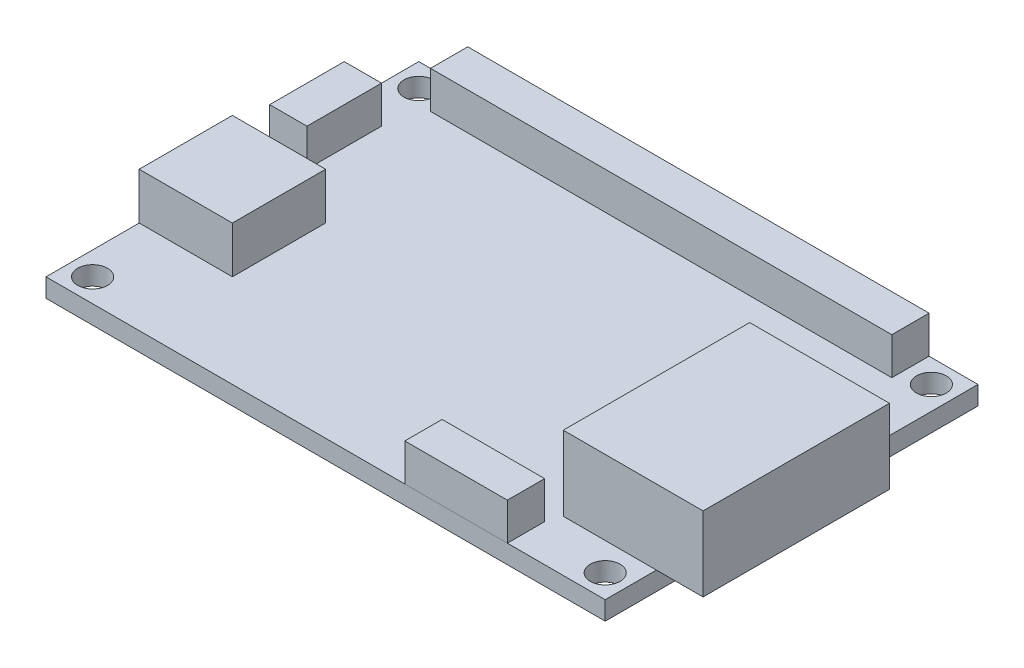
ISO-10303-21;
HEADER;
FILE_DESCRIPTION(('STEP AP214'),'2;1');
FILE_NAME('part.step','',(''),(''),'','','');
FILE_SCHEMA(('AUTOMOTIVE_DESIGN { 1 0 10303 214 1 1 1 1 }'));
ENDSEC;
DATA;
#1=APPLICATION_CONTEXT('core data for automotive mechanical design processes');
#2=APPLICATION_PROTOCOL_DEFINITION('international standard','automotive_design',2000,#1);
#3=PRODUCT_CONTEXT('',#1,'mechanical');
#4=PRODUCT('Part','Part','',(#3));
#5=PRODUCT_RELATED_PRODUCT_CATEGORY('part','',(#4));
#6=PRODUCT_DEFINITION_FORMATION('','',#4);
#7=PRODUCT_DEFINITION_CONTEXT('part definition',#1,'design');
#8=PRODUCT_DEFINITION('design','',#6,#7);
#9=PRODUCT_DEFINITION_SHAPE('','',#8);
#10=(LENGTH_UNIT() NAMED_UNIT(*) SI_UNIT(.MILLI.,.METRE.));
#11=(NAMED_UNIT(*) PLANE_ANGLE_UNIT() SI_UNIT($,.RADIAN.));
#12=(NAMED_UNIT(*) SI_UNIT($,.STERADIAN.) SOLID_ANGLE_UNIT());
#13=UNCERTAINTY_MEASURE_WITH_UNIT(LENGTH_MEASURE(1.E-05),#10,'distance_accuracy_value','');
#14=(GEOMETRIC_REPRESENTATION_CONTEXT(3) GLOBAL_UNCERTAINTY_ASSIGNED_CONTEXT((#13)) GLOBAL_UNIT_ASSIGNED_CONTEXT((#10,
#11,#12)) REPRESENTATION_CONTEXT('',''));
#15=CARTESIAN_POINT('',(0.,0.,0.));
#16=DIRECTION('',(0.,0.,1.));
#17=DIRECTION('',(1.,0.,0.));
#18=AXIS2_PLACEMENT_3D('',#15,#16,#17);
#19=CARTESIAN_POINT('',(0.,10.,14.5));
#20=DIRECTION('',(0.,0.,1.));
#21=DIRECTION('',(1.,0.,0.));
#22=AXIS2_PLACEMENT_3D('',#19,#20,#21);
#23=PLANE('',#22);
#24=DIRECTION('',(-1.,0.,0.));
#25=VECTOR('',#24,1.);
#26=CARTESIAN_POINT('',(0.,2.,14.5));
#27=LINE('',#26,#25);
#28=CARTESIAN_POINT('',(35.,2.,14.5));
#29=VERTEX_POINT('',#28);
#30=CARTESIAN_POINT('',(20.,2.,14.5));
#31=VERTEX_POINT('',#30);
#32=EDGE_CURVE('E176',#29,#31,#27,.T.);
#33=ORIENTED_EDGE('',*,*,#32,.F.);
#34=DIRECTION('',(0.,-1.,0.));
#35=VECTOR('',#34,1.);
#36=CARTESIAN_POINT('',(35.,10.,14.5));
#37=LINE('',#36,#35);
#38=CARTESIAN_POINT('',(35.,10.,14.5));
#39=VERTEX_POINT('',#38);
#40=EDGE_CURVE('E13',#39,#29,#37,.T.);
#41=ORIENTED_EDGE('',*,*,#40,.F.);
#42=DIRECTION('',(-1.,0.,0.));
#43=VECTOR('',#42,1.);
#44=CARTESIAN_POINT('',(0.,10.,14.5));
#45=LINE('',#44,#43);
#46=CARTESIAN_POINT('',(20.,10.,14.5));
#47=VERTEX_POINT('',#46);
#48=EDGE_CURVE('E170',#39,#47,#45,.T.);
#49=ORIENTED_EDGE('',*,*,#48,.T.);
#50=DIRECTION('',(0.,-1.,0.));
#51=VECTOR('',#50,1.);
#52=CARTESIAN_POINT('',(20.,10.,14.5));
#53=LINE('',#52,#51);
#54=EDGE_CURVE('E151',#47,#31,#53,.T.);
#55=ORIENTED_EDGE('',*,*,#54,.T.);
#56=EDGE_LOOP('',(#33,#41,#49,#55));
#57=FACE_BOUND('',#56,.T.);
#58=ADVANCED_FACE('F113',(#57),#23,.T.);
#59=CARTESIAN_POINT('',(35.,10.,0.));
#60=DIRECTION('',(1.,0.,0.));
#61=DIRECTION('',(0.,0.,-1.));
#62=AXIS2_PLACEMENT_3D('',#59,#60,#61);
#63=PLANE('',#62);
#64=DIRECTION('',(0.,0.,1.));
#65=VECTOR('',#64,1.);
#66=CARTESIAN_POINT('',(35.,2.,0.));
#67=LINE('',#66,#65);
#68=CARTESIAN_POINT('',(35.,2.,-5.49999999999999));
#69=VERTEX_POINT('',#68);
#70=EDGE_CURVE('E164',#69,#29,#67,.T.);
#71=ORIENTED_EDGE('',*,*,#70,.F.);
#72=DIRECTION('',(0.,-1.,0.));
#73=VECTOR('',#72,1.);
#74=CARTESIAN_POINT('',(35.,10.,-5.49999999999999));
#75=LINE('',#74,#73);
#76=CARTESIAN_POINT('',(35.,10.,-5.49999999999999));
#77=VERTEX_POINT('',#76);
#78=EDGE_CURVE('E121',#77,#69,#75,.T.);
#79=ORIENTED_EDGE('',*,*,#78,.F.);
#80=DIRECTION('',(0.,0.,1.));
#81=VECTOR('',#80,1.);
#82=CARTESIAN_POINT('',(35.,10.,0.));
#83=LINE('',#82,#81);
#84=EDGE_CURVE('E162',#77,#39,#83,.T.);
#85=ORIENTED_EDGE('',*,*,#84,.T.);
#86=ORIENTED_EDGE('',*,*,#40,.T.);
#87=EDGE_LOOP('',(#71,#79,#85,#86));
#88=FACE_BOUND('',#87,.T.);
#89=ADVANCED_FACE('F160',(#88),#63,.T.);
#90=CARTESIAN_POINT('',(0.,10.,-5.49999999999998));
#91=DIRECTION('',(0.,0.,1.));
#92=DIRECTION('',(1.,0.,0.));
#93=AXIS2_PLACEMENT_3D('',#90,#91,#92);
#94=PLANE('',#93);
#95=DIRECTION('',(-1.,0.,0.));
#96=VECTOR('',#95,1.);
#97=CARTESIAN_POINT('',(0.,2.,-5.49999999999998));
#98=LINE('',#97,#96);
#99=CARTESIAN_POINT('',(20.,2.,-5.49999999999999));
#100=VERTEX_POINT('',#99);
#101=EDGE_CURVE('E144',#69,#100,#98,.T.);
#102=ORIENTED_EDGE('',*,*,#101,.T.);
#103=DIRECTION('',(0.,-1.,0.));
#104=VECTOR('',#103,1.);
#105=CARTESIAN_POINT('',(20.,10.,-5.49999999999999));
#106=LINE('',#105,#104);
#107=CARTESIAN_POINT('',(20.,10.,-5.49999999999999));
#108=VERTEX_POINT('',#107);
#109=EDGE_CURVE('E165',#108,#100,#106,.T.);
#110=ORIENTED_EDGE('',*,*,#109,.F.);
#111=DIRECTION('',(-1.,0.,0.));
#112=VECTOR('',#111,1.);
#113=CARTESIAN_POINT('',(0.,10.,-5.49999999999998));
#114=LINE('',#113,#112);
#115=EDGE_CURVE('E166',#77,#108,#114,.T.);
#116=ORIENTED_EDGE('',*,*,#115,.F.);
#117=ORIENTED_EDGE('',*,*,#78,.T.);
#118=EDGE_LOOP('',(#102,#110,#116,#117));
#119=FACE_BOUND('',#118,.T.);
#120=ADVANCED_FACE('F167',(#119),#94,.F.);
#121=CARTESIAN_POINT('',(20.,10.,0.));
#122=DIRECTION('',(1.,0.,0.));
#123=DIRECTION('',(0.,0.,-1.));
#124=AXIS2_PLACEMENT_3D('',#121,#122,#123);
#125=PLANE('',#124);
#126=DIRECTION('',(0.,0.,1.));
#127=VECTOR('',#126,1.);
#128=CARTESIAN_POINT('',(20.,2.,0.));
#129=LINE('',#128,#127);
#130=EDGE_CURVE('E172',#100,#31,#129,.T.);
#131=ORIENTED_EDGE('',*,*,#130,.T.);
#132=ORIENTED_EDGE('',*,*,#54,.F.);
#133=DIRECTION('',(0.,0.,1.));
#134=VECTOR('',#133,1.);
#135=CARTESIAN_POINT('',(20.,10.,0.));
#136=LINE('',#135,#134);
#137=EDGE_CURVE('E129',#108,#47,#136,.T.);
#138=ORIENTED_EDGE('',*,*,#137,.F.);
#139=ORIENTED_EDGE('',*,*,#109,.T.);
#140=EDGE_LOOP('',(#131,#132,#138,#139));
#141=FACE_BOUND('',#140,.T.);
#142=ADVANCED_FACE('F185',(#141),#125,.F.);
#143=CARTESIAN_POINT('',(0.,10.,0.));
#144=DIRECTION('',(0.,1.,0.));
#145=DIRECTION('',(0.,0.,1.));
#146=AXIS2_PLACEMENT_3D('',#143,#144,#145);
#147=PLANE('',#146);
#148=ORIENTED_EDGE('',*,*,#48,.F.);
#149=ORIENTED_EDGE('',*,*,#84,.F.);
#150=ORIENTED_EDGE('',*,*,#115,.T.);
#151=ORIENTED_EDGE('',*,*,#137,.T.);
#152=EDGE_LOOP('',(#148,#149,#150,#151));
#153=FACE_BOUND('',#152,.T.);
#154=ADVANCED_FACE('F169',(#153),#147,.T.);
#155=CARTESIAN_POINT('',(0.,2.,0.));
#156=DIRECTION('',(0.,1.,0.));
#157=DIRECTION('',(0.,0.,1.));
#158=AXIS2_PLACEMENT_3D('',#155,#156,#157);
#159=PLANE('',#158);
#160=ORIENTED_EDGE('',*,*,#32,.T.);
#161=ORIENTED_EDGE('',*,*,#130,.F.);
#162=ORIENTED_EDGE('',*,*,#101,.F.);
#163=ORIENTED_EDGE('',*,*,#70,.T.);
#164=EDGE_LOOP('',(#160,#161,#162,#163));
#165=FACE_BOUND('',#164,.T.);
#166=ADVANCED_FACE('F187',(#165),#159,.F.);
#167=CLOSED_SHELL('',(#58,#89,#120,#142,#154,#166));
#168=MANIFOLD_SOLID_BREP('B2',#167);
#169=CARTESIAN_POINT('',(-20.,7.,0.));
#170=DIRECTION('',(1.,0.,0.));
#171=DIRECTION('',(0.,0.,-1.));
#172=AXIS2_PLACEMENT_3D('',#169,#170,#171);
#173=PLANE('',#172);
#174=DIRECTION('',(0.,0.,1.));
#175=VECTOR('',#174,1.);
#176=CARTESIAN_POINT('',(-20.,2.,0.));
#177=LINE('',#176,#175);
#178=CARTESIAN_POINT('',(-20.,2.,0.));
#179=VERTEX_POINT('',#178);
#180=CARTESIAN_POINT('',(-20.,2.,10.));
#181=VERTEX_POINT('',#180);
#182=EDGE_CURVE('E327',#179,#181,#177,.T.);
#183=ORIENTED_EDGE('',*,*,#182,.F.);
#184=DIRECTION('',(0.,-1.,0.));
#185=VECTOR('',#184,1.);
#186=CARTESIAN_POINT('',(-20.,7.,0.));
#187=LINE('',#186,#185);
#188=CARTESIAN_POINT('',(-20.,7.,0.));
#189=VERTEX_POINT('',#188);
#190=EDGE_CURVE('E111',#189,#179,#187,.T.);
#191=ORIENTED_EDGE('',*,*,#190,.F.);
#192=DIRECTION('',(0.,0.,1.));
#193=VECTOR('',#192,1.);
#194=CARTESIAN_POINT('',(-20.,7.,0.));
#195=LINE('',#194,#193);
#196=CARTESIAN_POINT('',(-20.,7.,10.));
#197=VERTEX_POINT('',#196);
#198=EDGE_CURVE('E321',#189,#197,#195,.T.);
#199=ORIENTED_EDGE('',*,*,#198,.T.);
#200=DIRECTION('',(0.,-1.,0.));
#201=VECTOR('',#200,1.);
#202=CARTESIAN_POINT('',(-20.,7.,10.));
#203=LINE('',#202,#201);
#204=EDGE_CURVE('E302',#197,#181,#203,.T.);
#205=ORIENTED_EDGE('',*,*,#204,.T.);
#206=EDGE_LOOP('',(#183,#191,#199,#205));
#207=FACE_BOUND('',#206,.T.);
#208=ADVANCED_FACE('F264',(#207),#173,.T.);
#209=CARTESIAN_POINT('',(0.,7.,0.));
#210=DIRECTION('',(0.,0.,-1.));
#211=DIRECTION('',(-1.,0.,0.));
#212=AXIS2_PLACEMENT_3D('',#209,#210,#211);
#213=PLANE('',#212);
#214=DIRECTION('',(1.,0.,0.));
#215=VECTOR('',#214,1.);
#216=CARTESIAN_POINT('',(0.,2.,0.));
#217=LINE('',#216,#215);
#218=CARTESIAN_POINT('',(-30.,2.,0.));
#219=VERTEX_POINT('',#218);
#220=EDGE_CURVE('E315',#219,#179,#217,.T.);
#221=ORIENTED_EDGE('',*,*,#220,.F.);
#222=DIRECTION('',(0.,-1.,0.));
#223=VECTOR('',#222,1.);
#224=CARTESIAN_POINT('',(-30.,7.,0.));
#225=LINE('',#224,#223);
#226=CARTESIAN_POINT('',(-30.,7.,0.));
#227=VERTEX_POINT('',#226);
#228=EDGE_CURVE('E272',#227,#219,#225,.T.);
#229=ORIENTED_EDGE('',*,*,#228,.F.);
#230=DIRECTION('',(1.,0.,0.));
#231=VECTOR('',#230,1.);
#232=CARTESIAN_POINT('',(0.,7.,0.));
#233=LINE('',#232,#231);
#234=EDGE_CURVE('E313',#227,#189,#233,.T.);
#235=ORIENTED_EDGE('',*,*,#234,.T.);
#236=ORIENTED_EDGE('',*,*,#190,.T.);
#237=EDGE_LOOP('',(#221,#229,#235,#236));
#238=FACE_BOUND('',#237,.T.);
#239=ADVANCED_FACE('F311',(#238),#213,.T.);
#240=CARTESIAN_POINT('',(-30.,7.,0.));
#241=DIRECTION('',(1.,0.,0.));
#242=DIRECTION('',(0.,0.,-1.));
#243=AXIS2_PLACEMENT_3D('',#240,#241,#242);
#244=PLANE('',#243);
#245=DIRECTION('',(0.,0.,1.));
#246=VECTOR('',#245,1.);
#247=CARTESIAN_POINT('',(-30.,2.,0.));
#248=LINE('',#247,#246);
#249=CARTESIAN_POINT('',(-30.,2.,10.));
#250=VERTEX_POINT('',#249);
#251=EDGE_CURVE('E295',#219,#250,#248,.T.);
#252=ORIENTED_EDGE('',*,*,#251,.T.);
#253=DIRECTION('',(0.,-1.,0.));
#254=VECTOR('',#253,1.);
#255=CARTESIAN_POINT('',(-30.,7.,10.));
#256=LINE('',#255,#254);
#257=CARTESIAN_POINT('',(-30.,7.,10.));
#258=VERTEX_POINT('',#257);
#259=EDGE_CURVE('E316',#258,#250,#256,.T.);
#260=ORIENTED_EDGE('',*,*,#259,.F.);
#261=DIRECTION('',(0.,0.,1.));
#262=VECTOR('',#261,1.);
#263=CARTESIAN_POINT('',(-30.,7.,0.));
#264=LINE('',#263,#262);
#265=EDGE_CURVE('E317',#227,#258,#264,.T.);
#266=ORIENTED_EDGE('',*,*,#265,.F.);
#267=ORIENTED_EDGE('',*,*,#228,.T.);
#268=EDGE_LOOP('',(#252,#260,#266,#267));
#269=FACE_BOUND('',#268,.T.);
#270=ADVANCED_FACE('F318',(#269),#244,.F.);
#271=CARTESIAN_POINT('',(0.,7.,10.));
#272=DIRECTION('',(0.,0.,-1.));
#273=DIRECTION('',(-1.,0.,0.));
#274=AXIS2_PLACEMENT_3D('',#271,#272,#273);
#275=PLANE('',#274);
#276=DIRECTION('',(1.,0.,0.));
#277=VECTOR('',#276,1.);
#278=CARTESIAN_POINT('',(0.,2.,10.));
#279=LINE('',#278,#277);
#280=EDGE_CURVE('E323',#250,#181,#279,.T.);
#281=ORIENTED_EDGE('',*,*,#280,.T.);
#282=ORIENTED_EDGE('',*,*,#204,.F.);
#283=DIRECTION('',(1.,0.,0.));
#284=VECTOR('',#283,1.);
#285=CARTESIAN_POINT('',(0.,7.,10.));
#286=LINE('',#285,#284);
#287=EDGE_CURVE('E280',#258,#197,#286,.T.);
#288=ORIENTED_EDGE('',*,*,#287,.F.);
#289=ORIENTED_EDGE('',*,*,#259,.T.);
#290=EDGE_LOOP('',(#281,#282,#288,#289));
#291=FACE_BOUND('',#290,.T.);
#292=ADVANCED_FACE('F336',(#291),#275,.F.);
#293=CARTESIAN_POINT('',(0.,7.,0.));
#294=DIRECTION('',(0.,1.,0.));
#295=DIRECTION('',(0.,0.,1.));
#296=AXIS2_PLACEMENT_3D('',#293,#294,#295);
#297=PLANE('',#296);
#298=ORIENTED_EDGE('',*,*,#198,.F.);
#299=ORIENTED_EDGE('',*,*,#234,.F.);
#300=ORIENTED_EDGE('',*,*,#265,.T.);
#301=ORIENTED_EDGE('',*,*,#287,.T.);
#302=EDGE_LOOP('',(#298,#299,#300,#301));
#303=FACE_BOUND('',#302,.T.);
#304=ADVANCED_FACE('F320',(#303),#297,.T.);
#305=CARTESIAN_POINT('',(0.,2.,0.));
#306=DIRECTION('',(0.,1.,0.));
#307=DIRECTION('',(0.,0.,1.));
#308=AXIS2_PLACEMENT_3D('',#305,#306,#307);
#309=PLANE('',#308);
#310=ORIENTED_EDGE('',*,*,#182,.T.);
#311=ORIENTED_EDGE('',*,*,#280,.F.);
#312=ORIENTED_EDGE('',*,*,#251,.F.);
#313=ORIENTED_EDGE('',*,*,#220,.T.);
#314=EDGE_LOOP('',(#310,#311,#312,#313));
#315=FACE_BOUND('',#314,.T.);
#316=ADVANCED_FACE('F338',(#315),#309,.F.);
#317=CLOSED_SHELL('',(#208,#239,#270,#292,#304,#316));
#318=MANIFOLD_SOLID_BREP('B7',#317);
#319=CARTESIAN_POINT('',(8.5,6.,16.));
#320=DIRECTION('',(1.,0.,0.));
#321=DIRECTION('',(0.,0.,-1.));
#322=AXIS2_PLACEMENT_3D('',#319,#320,#321);
#323=PLANE('',#322);
#324=DIRECTION('',(0.,0.,1.));
#325=VECTOR('',#324,1.);
#326=CARTESIAN_POINT('',(8.5,2.,16.));
#327=LINE('',#326,#325);
#328=CARTESIAN_POINT('',(8.5,2.,16.));
#329=VERTEX_POINT('',#328);
#330=CARTESIAN_POINT('',(8.5,2.,20.));
#331=VERTEX_POINT('',#330);
#332=EDGE_CURVE('E262',#329,#331,#327,.T.);
#333=ORIENTED_EDGE('',*,*,#332,.T.);
#334=DIRECTION('',(0.,-1.,0.));
#335=VECTOR('',#334,1.);
#336=CARTESIAN_POINT('',(8.5,6.,20.));
#337=LINE('',#336,#335);
#338=CARTESIAN_POINT('',(8.5,6.,20.));
#339=VERTEX_POINT('',#338);
#340=EDGE_CURVE('E483',#339,#331,#337,.T.);
#341=ORIENTED_EDGE('',*,*,#340,.F.);
#342=DIRECTION('',(0.,0.,1.));
#343=VECTOR('',#342,1.);
#344=CARTESIAN_POINT('',(8.5,6.,16.));
#345=LINE('',#344,#343);
#346=CARTESIAN_POINT('',(8.5,6.,16.));
#347=VERTEX_POINT('',#346);
#348=EDGE_CURVE('E416',#347,#339,#345,.T.);
#349=ORIENTED_EDGE('',*,*,#348,.F.);
#350=DIRECTION('',(0.,-1.,0.));
#351=VECTOR('',#350,1.);
#352=CARTESIAN_POINT('',(8.5,6.,16.));
#353=LINE('',#352,#351);
#354=EDGE_CURVE('E456',#347,#329,#353,.T.);
#355=ORIENTED_EDGE('',*,*,#354,.T.);
#356=EDGE_LOOP('',(#333,#341,#349,#355));
#357=FACE_BOUND('',#356,.T.);
#358=ADVANCED_FACE('F412',(#357),#323,.F.);
#359=CARTESIAN_POINT('',(8.5,6.,20.));
#360=DIRECTION('',(0.,0.,-1.));
#361=DIRECTION('',(-1.,0.,0.));
#362=AXIS2_PLACEMENT_3D('',#359,#360,#361);
#363=PLANE('',#362);
#364=DIRECTION('',(1.,0.,0.));
#365=VECTOR('',#364,1.);
#366=CARTESIAN_POINT('',(8.5,2.,20.));
#367=LINE('',#366,#365);
#368=CARTESIAN_POINT('',(19.5,2.,20.));
#369=VERTEX_POINT('',#368);
#370=EDGE_CURVE('E422',#331,#369,#367,.T.);
#371=ORIENTED_EDGE('',*,*,#370,.T.);
#372=DIRECTION('',(0.,-1.,0.));
#373=VECTOR('',#372,1.);
#374=CARTESIAN_POINT('',(19.5,6.,20.));
#375=LINE('',#374,#373);
#376=CARTESIAN_POINT('',(19.5,6.,20.));
#377=VERTEX_POINT('',#376);
#378=EDGE_CURVE('E470',#377,#369,#375,.T.);
#379=ORIENTED_EDGE('',*,*,#378,.F.);
#380=DIRECTION('',(1.,0.,0.));
#381=VECTOR('',#380,1.);
#382=CARTESIAN_POINT('',(8.5,6.,20.));
#383=LINE('',#382,#381);
#384=EDGE_CURVE('E448',#339,#377,#383,.T.);
#385=ORIENTED_EDGE('',*,*,#384,.F.);
#386=ORIENTED_EDGE('',*,*,#340,.T.);
#387=EDGE_LOOP('',(#371,#379,#385,#386));
#388=FACE_BOUND('',#387,.T.);
#389=ADVANCED_FACE('F486',(#388),#363,.F.);
#390=CARTESIAN_POINT('',(19.5,6.,16.));
#391=DIRECTION('',(1.,0.,0.));
#392=DIRECTION('',(0.,0.,-1.));
#393=AXIS2_PLACEMENT_3D('',#390,#391,#392);
#394=PLANE('',#393);
#395=DIRECTION('',(0.,0.,1.));
#396=VECTOR('',#395,1.);
#397=CARTESIAN_POINT('',(19.5,2.,16.));
#398=LINE('',#397,#396);
#399=CARTESIAN_POINT('',(19.5,2.,16.));
#400=VERTEX_POINT('',#399);
#401=EDGE_CURVE('E472',#400,#369,#398,.T.);
#402=ORIENTED_EDGE('',*,*,#401,.F.);
#403=DIRECTION('',(0.,-1.,0.));
#404=VECTOR('',#403,1.);
#405=CARTESIAN_POINT('',(19.5,6.,16.));
#406=LINE('',#405,#404);
#407=CARTESIAN_POINT('',(19.5,6.,16.));
#408=VERTEX_POINT('',#407);
#409=EDGE_CURVE('E461',#408,#400,#406,.T.);
#410=ORIENTED_EDGE('',*,*,#409,.F.);
#411=DIRECTION('',(0.,0.,1.));
#412=VECTOR('',#411,1.);
#413=CARTESIAN_POINT('',(19.5,6.,16.));
#414=LINE('',#413,#412);
#415=EDGE_CURVE('E481',#408,#377,#414,.T.);
#416=ORIENTED_EDGE('',*,*,#415,.T.);
#417=ORIENTED_EDGE('',*,*,#378,.T.);
#418=EDGE_LOOP('',(#402,#410,#416,#417));
#419=FACE_BOUND('',#418,.T.);
#420=ADVANCED_FACE('F473',(#419),#394,.T.);
#421=CARTESIAN_POINT('',(8.5,6.,16.));
#422=DIRECTION('',(0.,0.,-1.));
#423=DIRECTION('',(-1.,0.,0.));
#424=AXIS2_PLACEMENT_3D('',#421,#422,#423);
#425=PLANE('',#424);
#426=DIRECTION('',(1.,0.,0.));
#427=VECTOR('',#426,1.);
#428=CARTESIAN_POINT('',(8.5,2.,16.));
#429=LINE('',#428,#427);
#430=EDGE_CURVE('E465',#329,#400,#429,.T.);
#431=ORIENTED_EDGE('',*,*,#430,.F.);
#432=ORIENTED_EDGE('',*,*,#354,.F.);
#433=DIRECTION('',(1.,0.,0.));
#434=VECTOR('',#433,1.);
#435=CARTESIAN_POINT('',(8.5,6.,16.));
#436=LINE('',#435,#434);
#437=EDGE_CURVE('E467',#347,#408,#436,.T.);
#438=ORIENTED_EDGE('',*,*,#437,.T.);
#439=ORIENTED_EDGE('',*,*,#409,.T.);
#440=EDGE_LOOP('',(#431,#432,#438,#439));
#441=FACE_BOUND('',#440,.T.);
#442=ADVANCED_FACE('F463',(#441),#425,.T.);
#443=CARTESIAN_POINT('',(0.,6.,0.));
#444=DIRECTION('',(0.,1.,0.));
#445=DIRECTION('',(0.,0.,1.));
#446=AXIS2_PLACEMENT_3D('',#443,#444,#445);
#447=PLANE('',#446);
#448=ORIENTED_EDGE('',*,*,#348,.T.);
#449=ORIENTED_EDGE('',*,*,#384,.T.);
#450=ORIENTED_EDGE('',*,*,#415,.F.);
#451=ORIENTED_EDGE('',*,*,#437,.F.);
#452=EDGE_LOOP('',(#448,#449,#450,#451));
#453=FACE_BOUND('',#452,.T.);
#454=ADVANCED_FACE('F414',(#453),#447,.T.);
#455=CARTESIAN_POINT('',(0.,2.,0.));
#456=DIRECTION('',(0.,1.,0.));
#457=DIRECTION('',(0.,0.,1.));
#458=AXIS2_PLACEMENT_3D('',#455,#456,#457);
#459=PLANE('',#458);
#460=ORIENTED_EDGE('',*,*,#332,.F.);
#461=ORIENTED_EDGE('',*,*,#430,.T.);
#462=ORIENTED_EDGE('',*,*,#401,.T.);
#463=ORIENTED_EDGE('',*,*,#370,.F.);
#464=EDGE_LOOP('',(#460,#461,#462,#463));
#465=FACE_BOUND('',#464,.T.);
#466=ADVANCED_FACE('F475',(#465),#459,.F.);
#467=CLOSED_SHELL('',(#358,#389,#420,#442,#454,#466));
#468=MANIFOLD_SOLID_BREP('B105',#467);
#469=CARTESIAN_POINT('',(-30.,6.,-12.));
#470=DIRECTION('',(0.,0.,-1.));
#471=DIRECTION('',(-1.,0.,0.));
#472=AXIS2_PLACEMENT_3D('',#469,#470,#471);
#473=PLANE('',#472);
#474=DIRECTION('',(1.,0.,0.));
#475=VECTOR('',#474,1.);
#476=CARTESIAN_POINT('',(-30.,2.,-12.));
#477=LINE('',#476,#475);
#478=CARTESIAN_POINT('',(-30.,2.,-12.));
#479=VERTEX_POINT('',#478);
#480=CARTESIAN_POINT('',(-26.,2.,-12.));
#481=VERTEX_POINT('',#480);
#482=EDGE_CURVE('E410',#479,#481,#477,.T.);
#483=ORIENTED_EDGE('',*,*,#482,.F.);
#484=DIRECTION('',(0.,-1.,0.));
#485=VECTOR('',#484,1.);
#486=CARTESIAN_POINT('',(-30.,6.,-12.));
#487=LINE('',#486,#485);
#488=CARTESIAN_POINT('',(-30.,6.,-12.));
#489=VERTEX_POINT('',#488);
#490=EDGE_CURVE('E603',#489,#479,#487,.T.);
#491=ORIENTED_EDGE('',*,*,#490,.F.);
#492=DIRECTION('',(1.,0.,0.));
#493=VECTOR('',#492,1.);
#494=CARTESIAN_POINT('',(-30.,6.,-12.));
#495=LINE('',#494,#493);
#496=CARTESIAN_POINT('',(-26.,6.,-12.));
#497=VERTEX_POINT('',#496);
#498=EDGE_CURVE('E561',#489,#497,#495,.T.);
#499=ORIENTED_EDGE('',*,*,#498,.T.);
#500=DIRECTION('',(0.,-1.,0.));
#501=VECTOR('',#500,1.);
#502=CARTESIAN_POINT('',(-26.,6.,-12.));
#503=LINE('',#502,#501);
#504=EDGE_CURVE('E576',#497,#481,#503,.T.);
#505=ORIENTED_EDGE('',*,*,#504,.T.);
#506=EDGE_LOOP('',(#483,#491,#499,#505));
#507=FACE_BOUND('',#506,.T.);
#508=ADVANCED_FACE('F557',(#507),#473,.T.);
#509=CARTESIAN_POINT('',(-30.,6.,-12.));
#510=DIRECTION('',(1.,0.,0.));
#511=DIRECTION('',(0.,0.,-1.));
#512=AXIS2_PLACEMENT_3D('',#509,#510,#511);
#513=PLANE('',#512);
#514=DIRECTION('',(0.,0.,1.));
#515=VECTOR('',#514,1.);
#516=CARTESIAN_POINT('',(-30.,2.,-12.));
#517=LINE('',#516,#515);
#518=CARTESIAN_POINT('',(-30.,2.,-3.99999999999999));
#519=VERTEX_POINT('',#518);
#520=EDGE_CURVE('E606',#479,#519,#517,.T.);
#521=ORIENTED_EDGE('',*,*,#520,.T.);
#522=DIRECTION('',(0.,-1.,0.));
#523=VECTOR('',#522,1.);
#524=CARTESIAN_POINT('',(-30.,6.,-3.99999999999999));
#525=LINE('',#524,#523);
#526=CARTESIAN_POINT('',(-30.,6.,-3.99999999999999));
#527=VERTEX_POINT('',#526);
#528=EDGE_CURVE('E609',#527,#519,#525,.T.);
#529=ORIENTED_EDGE('',*,*,#528,.F.);
#530=DIRECTION('',(0.,0.,1.));
#531=VECTOR('',#530,1.);
#532=CARTESIAN_POINT('',(-30.,6.,-12.));
#533=LINE('',#532,#531);
#534=EDGE_CURVE('E625',#489,#527,#533,.T.);
#535=ORIENTED_EDGE('',*,*,#534,.F.);
#536=ORIENTED_EDGE('',*,*,#490,.T.);
#537=EDGE_LOOP('',(#521,#529,#535,#536));
#538=FACE_BOUND('',#537,.T.);
#539=ADVANCED_FACE('F608',(#538),#513,.F.);
#540=CARTESIAN_POINT('',(-30.,6.,-3.99999999999999));
#541=DIRECTION('',(0.,0.,-1.));
#542=DIRECTION('',(-1.,0.,0.));
#543=AXIS2_PLACEMENT_3D('',#540,#541,#542);
#544=PLANE('',#543);
#545=DIRECTION('',(1.,0.,0.));
#546=VECTOR('',#545,1.);
#547=CARTESIAN_POINT('',(-30.,2.,-3.99999999999999));
#548=LINE('',#547,#546);
#549=CARTESIAN_POINT('',(-26.,2.,-3.99999999999999));
#550=VERTEX_POINT('',#549);
#551=EDGE_CURVE('E612',#519,#550,#548,.T.);
#552=ORIENTED_EDGE('',*,*,#551,.T.);
#553=DIRECTION('',(0.,-1.,0.));
#554=VECTOR('',#553,1.);
#555=CARTESIAN_POINT('',(-26.,6.,-3.99999999999999));
#556=LINE('',#555,#554);
#557=CARTESIAN_POINT('',(-26.,6.,-3.99999999999999));
#558=VERTEX_POINT('',#557);
#559=EDGE_CURVE('E618',#558,#550,#556,.T.);
#560=ORIENTED_EDGE('',*,*,#559,.F.);
#561=DIRECTION('',(1.,0.,0.));
#562=VECTOR('',#561,1.);
#563=CARTESIAN_POINT('',(-30.,6.,-3.99999999999999));
#564=LINE('',#563,#562);
#565=EDGE_CURVE('E593',#527,#558,#564,.T.);
#566=ORIENTED_EDGE('',*,*,#565,.F.);
#567=ORIENTED_EDGE('',*,*,#528,.T.);
#568=EDGE_LOOP('',(#552,#560,#566,#567));
#569=FACE_BOUND('',#568,.T.);
#570=ADVANCED_FACE('F616',(#569),#544,.F.);
#571=CARTESIAN_POINT('',(-26.,6.,-12.));
#572=DIRECTION('',(1.,0.,0.));
#573=DIRECTION('',(0.,0.,-1.));
#574=AXIS2_PLACEMENT_3D('',#571,#572,#573);
#575=PLANE('',#574);
#576=DIRECTION('',(0.,0.,1.));
#577=VECTOR('',#576,1.);
#578=CARTESIAN_POINT('',(-26.,2.,-12.));
#579=LINE('',#578,#577);
#580=EDGE_CURVE('E567',#481,#550,#579,.T.);
#581=ORIENTED_EDGE('',*,*,#580,.F.);
#582=ORIENTED_EDGE('',*,*,#504,.F.);
#583=DIRECTION('',(0.,0.,1.));
#584=VECTOR('',#583,1.);
#585=CARTESIAN_POINT('',(-26.,6.,-12.));
#586=LINE('',#585,#584);
#587=EDGE_CURVE('E627',#497,#558,#586,.T.);
#588=ORIENTED_EDGE('',*,*,#587,.T.);
#589=ORIENTED_EDGE('',*,*,#559,.T.);
#590=EDGE_LOOP('',(#581,#582,#588,#589));
#591=FACE_BOUND('',#590,.T.);
#592=ADVANCED_FACE('F630',(#591),#575,.T.);
#593=CARTESIAN_POINT('',(0.,6.,0.));
#594=DIRECTION('',(0.,-1.,0.));
#595=DIRECTION('',(0.,0.,-1.));
#596=AXIS2_PLACEMENT_3D('',#593,#594,#595);
#597=PLANE('',#596);
#598=ORIENTED_EDGE('',*,*,#498,.F.);
#599=ORIENTED_EDGE('',*,*,#534,.T.);
#600=ORIENTED_EDGE('',*,*,#565,.T.);
#601=ORIENTED_EDGE('',*,*,#587,.F.);
#602=EDGE_LOOP('',(#598,#599,#600,#601));
#603=FACE_BOUND('',#602,.T.);
#604=ADVANCED_FACE('F559',(#603),#597,.F.);
#605=CARTESIAN_POINT('',(0.,2.,0.));
#606=DIRECTION('',(0.,-1.,0.));
#607=DIRECTION('',(0.,0.,-1.));
#608=AXIS2_PLACEMENT_3D('',#605,#606,#607);
#609=PLANE('',#608);
#610=ORIENTED_EDGE('',*,*,#482,.T.);
#611=ORIENTED_EDGE('',*,*,#580,.T.);
#612=ORIENTED_EDGE('',*,*,#551,.F.);
#613=ORIENTED_EDGE('',*,*,#520,.F.);
#614=EDGE_LOOP('',(#610,#611,#612,#613));
#615=FACE_BOUND('',#614,.T.);
#616=ADVANCED_FACE('F620',(#615),#609,.T.);
#617=CLOSED_SHELL('',(#508,#539,#570,#592,#604,#616));
#618=MANIFOLD_SOLID_BREP('B256',#617);
#619=CARTESIAN_POINT('',(-24.75,6.,-20.));
#620=DIRECTION('',(1.,0.,0.));
#621=DIRECTION('',(0.,0.,-1.));
#622=AXIS2_PLACEMENT_3D('',#619,#620,#621);
#623=PLANE('',#622);
#624=DIRECTION('',(0.,0.,1.));
#625=VECTOR('',#624,1.);
#626=CARTESIAN_POINT('',(-24.75,2.,-20.));
#627=LINE('',#626,#625);
#628=CARTESIAN_POINT('',(-24.75,2.,-20.));
#629=VERTEX_POINT('',#628);
#630=CARTESIAN_POINT('',(-24.75,2.,-16.));
#631=VERTEX_POINT('',#630);
#632=EDGE_CURVE('E764',#629,#631,#627,.T.);
#633=ORIENTED_EDGE('',*,*,#632,.T.);
#634=DIRECTION('',(0.,-1.,0.));
#635=VECTOR('',#634,1.);
#636=CARTESIAN_POINT('',(-24.75,6.,-16.));
#637=LINE('',#636,#635);
#638=CARTESIAN_POINT('',(-24.75,6.,-16.));
#639=VERTEX_POINT('',#638);
#640=EDGE_CURVE('E555',#639,#631,#637,.T.);
#641=ORIENTED_EDGE('',*,*,#640,.F.);
#642=DIRECTION('',(0.,0.,1.));
#643=VECTOR('',#642,1.);
#644=CARTESIAN_POINT('',(-24.75,6.,-20.));
#645=LINE('',#644,#643);
#646=CARTESIAN_POINT('',(-24.75,6.,-20.));
#647=VERTEX_POINT('',#646);
#648=EDGE_CURVE('E750',#647,#639,#645,.T.);
#649=ORIENTED_EDGE('',*,*,#648,.F.);
#650=DIRECTION('',(0.,-1.,0.));
#651=VECTOR('',#650,1.);
#652=CARTESIAN_POINT('',(-24.75,6.,-20.));
#653=LINE('',#652,#651);
#654=EDGE_CURVE('E717',#647,#629,#653,.T.);
#655=ORIENTED_EDGE('',*,*,#654,.T.);
#656=EDGE_LOOP('',(#633,#641,#649,#655));
#657=FACE_BOUND('',#656,.T.);
#658=ADVANCED_FACE('F701',(#657),#623,.F.);
#659=CARTESIAN_POINT('',(-24.75,6.,-16.));
#660=DIRECTION('',(0.,0.,-1.));
#661=DIRECTION('',(-1.,0.,0.));
#662=AXIS2_PLACEMENT_3D('',#659,#660,#661);
#663=PLANE('',#662);
#664=DIRECTION('',(1.,0.,0.));
#665=VECTOR('',#664,1.);
#666=CARTESIAN_POINT('',(-24.75,2.,-16.));
#667=LINE('',#666,#665);
#668=CARTESIAN_POINT('',(24.75,2.,-16.));
#669=VERTEX_POINT('',#668);
#670=EDGE_CURVE('E755',#631,#669,#667,.T.);
#671=ORIENTED_EDGE('',*,*,#670,.T.);
#672=DIRECTION('',(0.,-1.,0.));
#673=VECTOR('',#672,1.);
#674=CARTESIAN_POINT('',(24.75,6.,-16.));
#675=LINE('',#674,#673);
#676=CARTESIAN_POINT('',(24.75,6.,-16.));
#677=VERTEX_POINT('',#676);
#678=EDGE_CURVE('E709',#677,#669,#675,.T.);
#679=ORIENTED_EDGE('',*,*,#678,.F.);
#680=DIRECTION('',(1.,0.,0.));
#681=VECTOR('',#680,1.);
#682=CARTESIAN_POINT('',(-24.75,6.,-16.));
#683=LINE('',#682,#681);
#684=EDGE_CURVE('E742',#639,#677,#683,.T.);
#685=ORIENTED_EDGE('',*,*,#684,.F.);
#686=ORIENTED_EDGE('',*,*,#640,.T.);
#687=EDGE_LOOP('',(#671,#679,#685,#686));
#688=FACE_BOUND('',#687,.T.);
#689=ADVANCED_FACE('F754',(#688),#663,.F.);
#690=CARTESIAN_POINT('',(24.75,6.,-20.));
#691=DIRECTION('',(1.,0.,0.));
#692=DIRECTION('',(0.,0.,-1.));
#693=AXIS2_PLACEMENT_3D('',#690,#691,#692);
#694=PLANE('',#693);
#695=DIRECTION('',(0.,0.,1.));
#696=VECTOR('',#695,1.);
#697=CARTESIAN_POINT('',(24.75,2.,-20.));
#698=LINE('',#697,#696);
#699=CARTESIAN_POINT('',(24.75,2.,-20.));
#700=VERTEX_POINT('',#699);
#701=EDGE_CURVE('E767',#700,#669,#698,.T.);
#702=ORIENTED_EDGE('',*,*,#701,.F.);
#703=DIRECTION('',(0.,-1.,0.));
#704=VECTOR('',#703,1.);
#705=CARTESIAN_POINT('',(24.75,6.,-20.));
#706=LINE('',#705,#704);
#707=CARTESIAN_POINT('',(24.75,6.,-20.));
#708=VERTEX_POINT('',#707);
#709=EDGE_CURVE('E731',#708,#700,#706,.T.);
#710=ORIENTED_EDGE('',*,*,#709,.F.);
#711=DIRECTION('',(0.,0.,1.));
#712=VECTOR('',#711,1.);
#713=CARTESIAN_POINT('',(24.75,6.,-20.));
#714=LINE('',#713,#712);
#715=EDGE_CURVE('E749',#708,#677,#714,.T.);
#716=ORIENTED_EDGE('',*,*,#715,.T.);
#717=ORIENTED_EDGE('',*,*,#678,.T.);
#718=EDGE_LOOP('',(#702,#710,#716,#717));
#719=FACE_BOUND('',#718,.T.);
#720=ADVANCED_FACE('F758',(#719),#694,.T.);
#721=CARTESIAN_POINT('',(-24.75,6.,-20.));
#722=DIRECTION('',(0.,0.,-1.));
#723=DIRECTION('',(-1.,0.,0.));
#724=AXIS2_PLACEMENT_3D('',#721,#722,#723);
#725=PLANE('',#724);
#726=DIRECTION('',(1.,0.,0.));
#727=VECTOR('',#726,1.);
#728=CARTESIAN_POINT('',(-24.75,2.,-20.));
#729=LINE('',#728,#727);
#730=EDGE_CURVE('E769',#629,#700,#729,.T.);
#731=ORIENTED_EDGE('',*,*,#730,.F.);
#732=ORIENTED_EDGE('',*,*,#654,.F.);
#733=DIRECTION('',(1.,0.,0.));
#734=VECTOR('',#733,1.);
#735=CARTESIAN_POINT('',(-24.75,6.,-20.));
#736=LINE('',#735,#734);
#737=EDGE_CURVE('E759',#647,#708,#736,.T.);
#738=ORIENTED_EDGE('',*,*,#737,.T.);
#739=ORIENTED_EDGE('',*,*,#709,.T.);
#740=EDGE_LOOP('',(#731,#732,#738,#739));
#741=FACE_BOUND('',#740,.T.);
#742=ADVANCED_FACE('F775',(#741),#725,.T.);
#743=CARTESIAN_POINT('',(0.,6.,0.));
#744=DIRECTION('',(0.,1.,0.));
#745=DIRECTION('',(0.,0.,1.));
#746=AXIS2_PLACEMENT_3D('',#743,#744,#745);
#747=PLANE('',#746);
#748=ORIENTED_EDGE('',*,*,#648,.T.);
#749=ORIENTED_EDGE('',*,*,#684,.T.);
#750=ORIENTED_EDGE('',*,*,#715,.F.);
#751=ORIENTED_EDGE('',*,*,#737,.F.);
#752=EDGE_LOOP('',(#748,#749,#750,#751));
#753=FACE_BOUND('',#752,.T.);
#754=ADVANCED_FACE('F746',(#753),#747,.T.);
#755=CARTESIAN_POINT('',(0.,2.,0.));
#756=DIRECTION('',(0.,1.,0.));
#757=DIRECTION('',(0.,0.,1.));
#758=AXIS2_PLACEMENT_3D('',#755,#756,#757);
#759=PLANE('',#758);
#760=ORIENTED_EDGE('',*,*,#632,.F.);
#761=ORIENTED_EDGE('',*,*,#730,.T.);
#762=ORIENTED_EDGE('',*,*,#701,.T.);
#763=ORIENTED_EDGE('',*,*,#670,.F.);
#764=EDGE_LOOP('',(#760,#761,#762,#763));
#765=FACE_BOUND('',#764,.T.);
#766=ADVANCED_FACE('F774',(#765),#759,.F.);
#767=CLOSED_SHELL('',(#658,#689,#720,#742,#754,#766));
#768=MANIFOLD_SOLID_BREP('B404',#767);
#769=CARTESIAN_POINT('',(0.,2.,0.));
#770=DIRECTION('',(0.,-1.,0.));
#771=DIRECTION('',(0.,0.,-1.));
#772=AXIS2_PLACEMENT_3D('',#769,#770,#771);
#773=PLANE('',#772);
#774=CARTESIAN_POINT('',(27.5,2.,-17.5));
#775=DIRECTION('',(0.,-1.,0.));
#776=DIRECTION('',(0.,0.,-1.));
#777=AXIS2_PLACEMENT_3D('',#774,#775,#776);
#778=CIRCLE('',#777,1.6);
#779=CARTESIAN_POINT('',(27.5,2.,-19.1));
#780=VERTEX_POINT('',#779);
#781=EDGE_CURVE('E960',#780,#780,#778,.T.);
#782=ORIENTED_EDGE('',*,*,#781,.T.);
#783=EDGE_LOOP('',(#782));
#784=FACE_BOUND('',#783,.T.);
#785=CARTESIAN_POINT('',(-27.5,2.,17.5));
#786=DIRECTION('',(0.,-1.,0.));
#787=DIRECTION('',(0.,0.,-1.));
#788=AXIS2_PLACEMENT_3D('',#785,#786,#787);
#789=CIRCLE('',#788,1.6);
#790=CARTESIAN_POINT('',(-27.5,2.,15.9));
#791=VERTEX_POINT('',#790);
#792=EDGE_CURVE('E907',#791,#791,#789,.T.);
#793=ORIENTED_EDGE('',*,*,#792,.T.);
#794=EDGE_LOOP('',(#793));
#795=FACE_BOUND('',#794,.T.);
#796=DIRECTION('',(0.,0.,-1.));
#797=VECTOR('',#796,1.);
#798=CARTESIAN_POINT('',(-30.,2.,20.));
#799=LINE('',#798,#797);
#800=CARTESIAN_POINT('',(-30.,2.,20.));
#801=VERTEX_POINT('',#800);
#802=CARTESIAN_POINT('',(-30.,2.,-20.));
#803=VERTEX_POINT('',#802);
#804=EDGE_CURVE('E897',#801,#803,#799,.T.);
#805=ORIENTED_EDGE('',*,*,#804,.F.);
#806=DIRECTION('',(1.,0.,0.));
#807=VECTOR('',#806,1.);
#808=CARTESIAN_POINT('',(-30.,2.,20.));
#809=LINE('',#808,#807);
#810=CARTESIAN_POINT('',(30.,2.,20.));
#811=VERTEX_POINT('',#810);
#812=EDGE_CURVE('E887',#801,#811,#809,.T.);
#813=ORIENTED_EDGE('',*,*,#812,.T.);
#814=DIRECTION('',(0.,0.,-1.));
#815=VECTOR('',#814,1.);
#816=CARTESIAN_POINT('',(30.,2.,20.));
#817=LINE('',#816,#815);
#818=CARTESIAN_POINT('',(30.,2.,-20.));
#819=VERTEX_POINT('',#818);
#820=EDGE_CURVE('E882',#811,#819,#817,.T.);
#821=ORIENTED_EDGE('',*,*,#820,.T.);
#822=DIRECTION('',(1.,0.,0.));
#823=VECTOR('',#822,1.);
#824=CARTESIAN_POINT('',(-30.,2.,-20.));
#825=LINE('',#824,#823);
#826=EDGE_CURVE('E886',#803,#819,#825,.T.);
#827=ORIENTED_EDGE('',*,*,#826,.F.);
#828=EDGE_LOOP('',(#805,#813,#821,#827));
#829=FACE_BOUND('',#828,.T.);
#830=CARTESIAN_POINT('',(27.5,2.,17.5));
#831=DIRECTION('',(0.,1.,0.));
#832=DIRECTION('',(0.,0.,1.));
#833=AXIS2_PLACEMENT_3D('',#830,#831,#832);
#834=CIRCLE('',#833,1.6);
#835=CARTESIAN_POINT('',(27.5,2.,19.1));
#836=VERTEX_POINT('',#835);
#837=EDGE_CURVE('E953',#836,#836,#834,.T.);
#838=ORIENTED_EDGE('',*,*,#837,.F.);
#839=EDGE_LOOP('',(#838));
#840=FACE_BOUND('',#839,.T.);
#841=CARTESIAN_POINT('',(-27.5,2.,-17.5));
#842=DIRECTION('',(0.,1.,0.));
#843=DIRECTION('',(0.,0.,1.));
#844=AXIS2_PLACEMENT_3D('',#841,#842,#843);
#845=CIRCLE('',#844,1.6);
#846=CARTESIAN_POINT('',(-27.5,2.,-15.9));
#847=VERTEX_POINT('',#846);
#848=EDGE_CURVE('E965',#847,#847,#845,.T.);
#849=ORIENTED_EDGE('',*,*,#848,.F.);
#850=EDGE_LOOP('',(#849));
#851=FACE_BOUND('',#850,.T.);
#852=ADVANCED_FACE('F836',(#784,#795,#829,#840,#851),#773,.F.);
#853=CARTESIAN_POINT('',(0.,0.,0.));
#854=DIRECTION('',(0.,-1.,0.));
#855=DIRECTION('',(0.,0.,-1.));
#856=AXIS2_PLACEMENT_3D('',#853,#854,#855);
#857=PLANE('',#856);
#858=CARTESIAN_POINT('',(27.5,0.,17.5));
#859=DIRECTION('',(0.,1.,0.));
#860=DIRECTION('',(0.,0.,1.));
#861=AXIS2_PLACEMENT_3D('',#858,#859,#860);
#862=CIRCLE('',#861,1.6);
#863=CARTESIAN_POINT('',(27.5,0.,19.1));
#864=VERTEX_POINT('',#863);
#865=EDGE_CURVE('E956',#864,#864,#862,.T.);
#866=ORIENTED_EDGE('',*,*,#865,.T.);
#867=EDGE_LOOP('',(#866));
#868=FACE_BOUND('',#867,.T.);
#869=CARTESIAN_POINT('',(-27.5,0.,17.5));
#870=DIRECTION('',(0.,-1.,0.));
#871=DIRECTION('',(0.,0.,-1.));
#872=AXIS2_PLACEMENT_3D('',#869,#870,#871);
#873=CIRCLE('',#872,1.6);
#874=CARTESIAN_POINT('',(-27.5,0.,15.9));
#875=VERTEX_POINT('',#874);
#876=EDGE_CURVE('E951',#875,#875,#873,.T.);
#877=ORIENTED_EDGE('',*,*,#876,.F.);
#878=EDGE_LOOP('',(#877));
#879=FACE_BOUND('',#878,.T.);
#880=DIRECTION('',(0.,0.,-1.));
#881=VECTOR('',#880,1.);
#882=CARTESIAN_POINT('',(-30.,0.,20.));
#883=LINE('',#882,#881);
#884=CARTESIAN_POINT('',(-30.,0.,20.));
#885=VERTEX_POINT('',#884);
#886=CARTESIAN_POINT('',(-30.,0.,-20.));
#887=VERTEX_POINT('',#886);
#888=EDGE_CURVE('E903',#885,#887,#883,.T.);
#889=ORIENTED_EDGE('',*,*,#888,.T.);
#890=DIRECTION('',(1.,0.,0.));
#891=VECTOR('',#890,1.);
#892=CARTESIAN_POINT('',(-30.,0.,-20.));
#893=LINE('',#892,#891);
#894=CARTESIAN_POINT('',(30.,0.,-20.));
#895=VERTEX_POINT('',#894);
#896=EDGE_CURVE('E906',#887,#895,#893,.T.);
#897=ORIENTED_EDGE('',*,*,#896,.T.);
#898=DIRECTION('',(0.,0.,-1.));
#899=VECTOR('',#898,1.);
#900=CARTESIAN_POINT('',(30.,0.,20.));
#901=LINE('',#900,#899);
#902=CARTESIAN_POINT('',(30.,0.,20.));
#903=VERTEX_POINT('',#902);
#904=EDGE_CURVE('E894',#903,#895,#901,.T.);
#905=ORIENTED_EDGE('',*,*,#904,.F.);
#906=DIRECTION('',(1.,0.,0.));
#907=VECTOR('',#906,1.);
#908=CARTESIAN_POINT('',(-30.,0.,20.));
#909=LINE('',#908,#907);
#910=EDGE_CURVE('E870',#885,#903,#909,.T.);
#911=ORIENTED_EDGE('',*,*,#910,.F.);
#912=EDGE_LOOP('',(#889,#897,#905,#911));
#913=FACE_BOUND('',#912,.T.);
#914=CARTESIAN_POINT('',(27.5,0.,-17.5));
#915=DIRECTION('',(0.,-1.,0.));
#916=DIRECTION('',(0.,0.,-1.));
#917=AXIS2_PLACEMENT_3D('',#914,#915,#916);
#918=CIRCLE('',#917,1.6);
#919=CARTESIAN_POINT('',(27.5,0.,-19.1));
#920=VERTEX_POINT('',#919);
#921=EDGE_CURVE('E962',#920,#920,#918,.T.);
#922=ORIENTED_EDGE('',*,*,#921,.F.);
#923=EDGE_LOOP('',(#922));
#924=FACE_BOUND('',#923,.T.);
#925=CARTESIAN_POINT('',(-27.5,0.,-17.5));
#926=DIRECTION('',(0.,1.,0.));
#927=DIRECTION('',(0.,0.,1.));
#928=AXIS2_PLACEMENT_3D('',#925,#926,#927);
#929=CIRCLE('',#928,1.6);
#930=CARTESIAN_POINT('',(-27.5,0.,-15.9));
#931=VERTEX_POINT('',#930);
#932=EDGE_CURVE('E967',#931,#931,#929,.T.);
#933=ORIENTED_EDGE('',*,*,#932,.T.);
#934=EDGE_LOOP('',(#933));
#935=FACE_BOUND('',#934,.T.);
#936=ADVANCED_FACE('F912',(#868,#879,#913,#924,#935),#857,.T.);
#937=CARTESIAN_POINT('',(-30.,2.,20.));
#938=DIRECTION('',(-1.,0.,0.));
#939=DIRECTION('',(0.,0.,1.));
#940=AXIS2_PLACEMENT_3D('',#937,#938,#939);
#941=PLANE('',#940);
#942=ORIENTED_EDGE('',*,*,#888,.F.);
#943=DIRECTION('',(0.,-1.,0.));
#944=VECTOR('',#943,1.);
#945=CARTESIAN_POINT('',(-30.,2.,20.));
#946=LINE('',#945,#944);
#947=EDGE_CURVE('E699',#801,#885,#946,.T.);
#948=ORIENTED_EDGE('',*,*,#947,.F.);
#949=ORIENTED_EDGE('',*,*,#804,.T.);
#950=DIRECTION('',(0.,-1.,0.));
#951=VECTOR('',#950,1.);
#952=CARTESIAN_POINT('',(-30.,2.,-20.));
#953=LINE('',#952,#951);
#954=EDGE_CURVE('E840',#803,#887,#953,.T.);
#955=ORIENTED_EDGE('',*,*,#954,.T.);
#956=EDGE_LOOP('',(#942,#948,#949,#955));
#957=FACE_BOUND('',#956,.T.);
#958=ADVANCED_FACE('F838',(#957),#941,.T.);
#959=CARTESIAN_POINT('',(-30.,2.,20.));
#960=DIRECTION('',(0.,0.,-1.));
#961=DIRECTION('',(-1.,0.,0.));
#962=AXIS2_PLACEMENT_3D('',#959,#960,#961);
#963=PLANE('',#962);
#964=ORIENTED_EDGE('',*,*,#910,.T.);
#965=DIRECTION('',(0.,-1.,0.));
#966=VECTOR('',#965,1.);
#967=CARTESIAN_POINT('',(30.,2.,20.));
#968=LINE('',#967,#966);
#969=EDGE_CURVE('E846',#811,#903,#968,.T.);
#970=ORIENTED_EDGE('',*,*,#969,.F.);
#971=ORIENTED_EDGE('',*,*,#812,.F.);
#972=ORIENTED_EDGE('',*,*,#947,.T.);
#973=EDGE_LOOP('',(#964,#970,#971,#972));
#974=FACE_BOUND('',#973,.T.);
#975=ADVANCED_FACE('F915',(#974),#963,.F.);
#976=CARTESIAN_POINT('',(30.,2.,20.));
#977=DIRECTION('',(-1.,0.,0.));
#978=DIRECTION('',(0.,0.,1.));
#979=AXIS2_PLACEMENT_3D('',#976,#977,#978);
#980=PLANE('',#979);
#981=ORIENTED_EDGE('',*,*,#904,.T.);
#982=DIRECTION('',(0.,-1.,0.));
#983=VECTOR('',#982,1.);
#984=CARTESIAN_POINT('',(30.,2.,-20.));
#985=LINE('',#984,#983);
#986=EDGE_CURVE('E891',#819,#895,#985,.T.);
#987=ORIENTED_EDGE('',*,*,#986,.F.);
#988=ORIENTED_EDGE('',*,*,#820,.F.);
#989=ORIENTED_EDGE('',*,*,#969,.T.);
#990=EDGE_LOOP('',(#981,#987,#988,#989));
#991=FACE_BOUND('',#990,.T.);
#992=ADVANCED_FACE('F892',(#991),#980,.F.);
#993=CARTESIAN_POINT('',(-30.,2.,-20.));
#994=DIRECTION('',(0.,0.,-1.));
#995=DIRECTION('',(-1.,0.,0.));
#996=AXIS2_PLACEMENT_3D('',#993,#994,#995);
#997=PLANE('',#996);
#998=ORIENTED_EDGE('',*,*,#896,.F.);
#999=ORIENTED_EDGE('',*,*,#954,.F.);
#1000=ORIENTED_EDGE('',*,*,#826,.T.);
#1001=ORIENTED_EDGE('',*,*,#986,.T.);
#1002=EDGE_LOOP('',(#998,#999,#1000,#1001));
#1003=FACE_BOUND('',#1002,.T.);
#1004=ADVANCED_FACE('F896',(#1003),#997,.T.);
#1005=CARTESIAN_POINT('',(-27.5,2.,17.5));
#1006=DIRECTION('',(0.,-1.,0.));
#1007=DIRECTION('',(0.,0.,-1.));
#1008=AXIS2_PLACEMENT_3D('',#1005,#1006,#1007);
#1009=CYLINDRICAL_SURFACE('',#1008,1.6);
#1010=ORIENTED_EDGE('',*,*,#792,.F.);
#1011=EDGE_LOOP('',(#1010));
#1012=FACE_BOUND('',#1011,.T.);
#1013=ORIENTED_EDGE('',*,*,#876,.T.);
#1014=EDGE_LOOP('',(#1013));
#1015=FACE_BOUND('',#1014,.T.);
#1016=ADVANCED_FACE('F931',(#1012,#1015),#1009,.F.);
#1017=CARTESIAN_POINT('',(27.5,2.,17.5));
#1018=DIRECTION('',(0.,-1.,0.));
#1019=DIRECTION('',(0.,0.,-1.));
#1020=AXIS2_PLACEMENT_3D('',#1017,#1018,#1019);
#1021=CYLINDRICAL_SURFACE('',#1020,1.6);
#1022=ORIENTED_EDGE('',*,*,#837,.T.);
#1023=EDGE_LOOP('',(#1022));
#1024=FACE_BOUND('',#1023,.T.);
#1025=ORIENTED_EDGE('',*,*,#865,.F.);
#1026=EDGE_LOOP('',(#1025));
#1027=FACE_BOUND('',#1026,.T.);
#1028=ADVANCED_FACE('F939',(#1024,#1027),#1021,.F.);
#1029=CARTESIAN_POINT('',(27.5,2.,-17.5));
#1030=DIRECTION('',(0.,-1.,0.));
#1031=DIRECTION('',(0.,0.,-1.));
#1032=AXIS2_PLACEMENT_3D('',#1029,#1030,#1031);
#1033=CYLINDRICAL_SURFACE('',#1032,1.6);
#1034=ORIENTED_EDGE('',*,*,#781,.F.);
#1035=EDGE_LOOP('',(#1034));
#1036=FACE_BOUND('',#1035,.T.);
#1037=ORIENTED_EDGE('',*,*,#921,.T.);
#1038=EDGE_LOOP('',(#1037));
#1039=FACE_BOUND('',#1038,.T.);
#1040=ADVANCED_FACE('F944',(#1036,#1039),#1033,.F.);
#1041=CARTESIAN_POINT('',(-27.5,2.,-17.5));
#1042=DIRECTION('',(0.,-1.,0.));
#1043=DIRECTION('',(0.,0.,-1.));
#1044=AXIS2_PLACEMENT_3D('',#1041,#1042,#1043);
#1045=CYLINDRICAL_SURFACE('',#1044,1.6);
#1046=ORIENTED_EDGE('',*,*,#848,.T.);
#1047=EDGE_LOOP('',(#1046));
#1048=FACE_BOUND('',#1047,.T.);
#1049=ORIENTED_EDGE('',*,*,#932,.F.);
#1050=EDGE_LOOP('',(#1049));
#1051=FACE_BOUND('',#1050,.T.);
#1052=ADVANCED_FACE('F973',(#1048,#1051),#1045,.F.);
#1053=CLOSED_SHELL('',(#852,#936,#958,#975,#992,#1004,#1016,#1028,#1040,#1052));
#1054=MANIFOLD_SOLID_BREP('B549',#1053);
#1055=ADVANCED_BREP_SHAPE_REPRESENTATION('',(#18,#168,#318,#468,#618,#768,#1054),#14);
#1056=SHAPE_DEFINITION_REPRESENTATION(#9,#1055);
ENDSEC;
END-ISO-10303-21;
